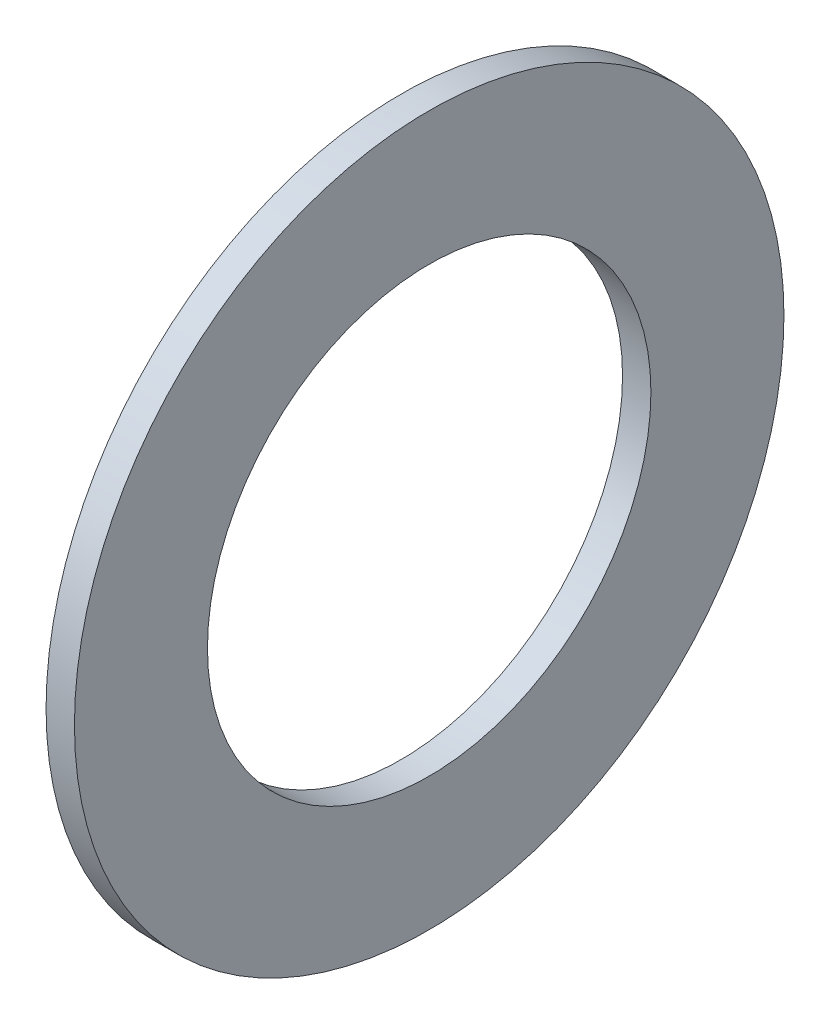
ISO-10303-21;
HEADER;
FILE_DESCRIPTION(('STEP AP214'),'2;1');
FILE_NAME('part.step','',(''),(''),'','','');
FILE_SCHEMA(('AUTOMOTIVE_DESIGN { 1 0 10303 214 1 1 1 1 }'));
ENDSEC;
DATA;
#1=APPLICATION_CONTEXT('core data for automotive mechanical design processes');
#2=APPLICATION_PROTOCOL_DEFINITION('international standard','automotive_design',2000,#1);
#3=PRODUCT_CONTEXT('',#1,'mechanical');
#4=PRODUCT('Part','Part','',(#3));
#5=PRODUCT_RELATED_PRODUCT_CATEGORY('part','',(#4));
#6=PRODUCT_DEFINITION_FORMATION('','',#4);
#7=PRODUCT_DEFINITION_CONTEXT('part definition',#1,'design');
#8=PRODUCT_DEFINITION('design','',#6,#7);
#9=PRODUCT_DEFINITION_SHAPE('','',#8);
#10=(LENGTH_UNIT() NAMED_UNIT(*) SI_UNIT(.MILLI.,.METRE.));
#11=(NAMED_UNIT(*) PLANE_ANGLE_UNIT() SI_UNIT($,.RADIAN.));
#12=(NAMED_UNIT(*) SI_UNIT($,.STERADIAN.) SOLID_ANGLE_UNIT());
#13=UNCERTAINTY_MEASURE_WITH_UNIT(LENGTH_MEASURE(1.E-05),#10,'distance_accuracy_value','');
#14=(GEOMETRIC_REPRESENTATION_CONTEXT(3) GLOBAL_UNCERTAINTY_ASSIGNED_CONTEXT((#13)) GLOBAL_UNIT_ASSIGNED_CONTEXT((#10,
#11,#12)) REPRESENTATION_CONTEXT('',''));
#15=CARTESIAN_POINT('',(0.,0.,0.));
#16=DIRECTION('',(0.,0.,1.));
#17=DIRECTION('',(1.,0.,0.));
#18=AXIS2_PLACEMENT_3D('',#15,#16,#17);
#19=CARTESIAN_POINT('',(0.508,0.,0.));
#20=DIRECTION('',(1.,0.,0.));
#21=DIRECTION('',(0.,0.,-1.));
#22=AXIS2_PLACEMENT_3D('',#19,#20,#21);
#23=PLANE('',#22);
#24=CARTESIAN_POINT('',(0.508,0.,0.));
#25=DIRECTION('',(1.,0.,0.));
#26=DIRECTION('',(0.,0.,-1.));
#27=AXIS2_PLACEMENT_3D('',#24,#25,#26);
#28=CIRCLE('',#27,6.35);
#29=CARTESIAN_POINT('',(0.508,0.,-6.35));
#30=VERTEX_POINT('',#29);
#31=EDGE_CURVE('E10',#30,#30,#28,.T.);
#32=ORIENTED_EDGE('',*,*,#31,.T.);
#33=EDGE_LOOP('',(#32));
#34=FACE_BOUND('',#33,.T.);
#35=CARTESIAN_POINT('',(0.508,0.,0.));
#36=DIRECTION('',(1.,0.,0.));
#37=DIRECTION('',(0.,0.,-1.));
#38=AXIS2_PLACEMENT_3D('',#35,#36,#37);
#39=CIRCLE('',#38,3.96875);
#40=CARTESIAN_POINT('',(0.508,0.,-3.96875));
#41=VERTEX_POINT('',#40);
#42=EDGE_CURVE('E42',#41,#41,#39,.T.);
#43=ORIENTED_EDGE('',*,*,#42,.F.);
#44=EDGE_LOOP('',(#43));
#45=FACE_BOUND('',#44,.T.);
#46=ADVANCED_FACE('F31',(#34,#45),#23,.T.);
#47=CARTESIAN_POINT('',(0.,0.,0.));
#48=DIRECTION('',(1.,0.,0.));
#49=DIRECTION('',(0.,0.,-1.));
#50=AXIS2_PLACEMENT_3D('',#47,#48,#49);
#51=PLANE('',#50);
#52=CARTESIAN_POINT('',(0.,0.,0.));
#53=DIRECTION('',(1.,0.,0.));
#54=DIRECTION('',(0.,0.,-1.));
#55=AXIS2_PLACEMENT_3D('',#52,#53,#54);
#56=CIRCLE('',#55,6.35);
#57=CARTESIAN_POINT('',(0.,0.,-6.35));
#58=VERTEX_POINT('',#57);
#59=EDGE_CURVE('E35',#58,#58,#56,.T.);
#60=ORIENTED_EDGE('',*,*,#59,.F.);
#61=EDGE_LOOP('',(#60));
#62=FACE_BOUND('',#61,.T.);
#63=CARTESIAN_POINT('',(0.,0.,0.));
#64=DIRECTION('',(1.,0.,0.));
#65=DIRECTION('',(0.,0.,-1.));
#66=AXIS2_PLACEMENT_3D('',#63,#64,#65);
#67=CIRCLE('',#66,3.96875);
#68=CARTESIAN_POINT('',(0.,0.,-3.96875));
#69=VERTEX_POINT('',#68);
#70=EDGE_CURVE('E44',#69,#69,#67,.T.);
#71=ORIENTED_EDGE('',*,*,#70,.T.);
#72=EDGE_LOOP('',(#71));
#73=FACE_BOUND('',#72,.T.);
#74=ADVANCED_FACE('F54',(#62,#73),#51,.F.);
#75=CARTESIAN_POINT('',(0.508,0.,0.));
#76=DIRECTION('',(-1.,0.,0.));
#77=DIRECTION('',(0.,0.,1.));
#78=AXIS2_PLACEMENT_3D('',#75,#76,#77);
#79=CYLINDRICAL_SURFACE('',#78,6.35);
#80=ORIENTED_EDGE('',*,*,#31,.F.);
#81=EDGE_LOOP('',(#80));
#82=FACE_BOUND('',#81,.T.);
#83=ORIENTED_EDGE('',*,*,#59,.T.);
#84=EDGE_LOOP('',(#83));
#85=FACE_BOUND('',#84,.T.);
#86=ADVANCED_FACE('F33',(#82,#85),#79,.T.);
#87=CARTESIAN_POINT('',(0.508,0.,0.));
#88=DIRECTION('',(-1.,0.,0.));
#89=DIRECTION('',(0.,0.,1.));
#90=AXIS2_PLACEMENT_3D('',#87,#88,#89);
#91=CYLINDRICAL_SURFACE('',#90,3.96875);
#92=ORIENTED_EDGE('',*,*,#42,.T.);
#93=EDGE_LOOP('',(#92));
#94=FACE_BOUND('',#93,.T.);
#95=ORIENTED_EDGE('',*,*,#70,.F.);
#96=EDGE_LOOP('',(#95));
#97=FACE_BOUND('',#96,.T.);
#98=ADVANCED_FACE('F50',(#94,#97),#91,.F.);
#99=CLOSED_SHELL('',(#46,#74,#86,#98));
#100=MANIFOLD_SOLID_BREP('B2',#99);
#101=ADVANCED_BREP_SHAPE_REPRESENTATION('',(#18,#100),#14);
#102=SHAPE_DEFINITION_REPRESENTATION(#9,#101);
ENDSEC;
END-ISO-10303-21;
